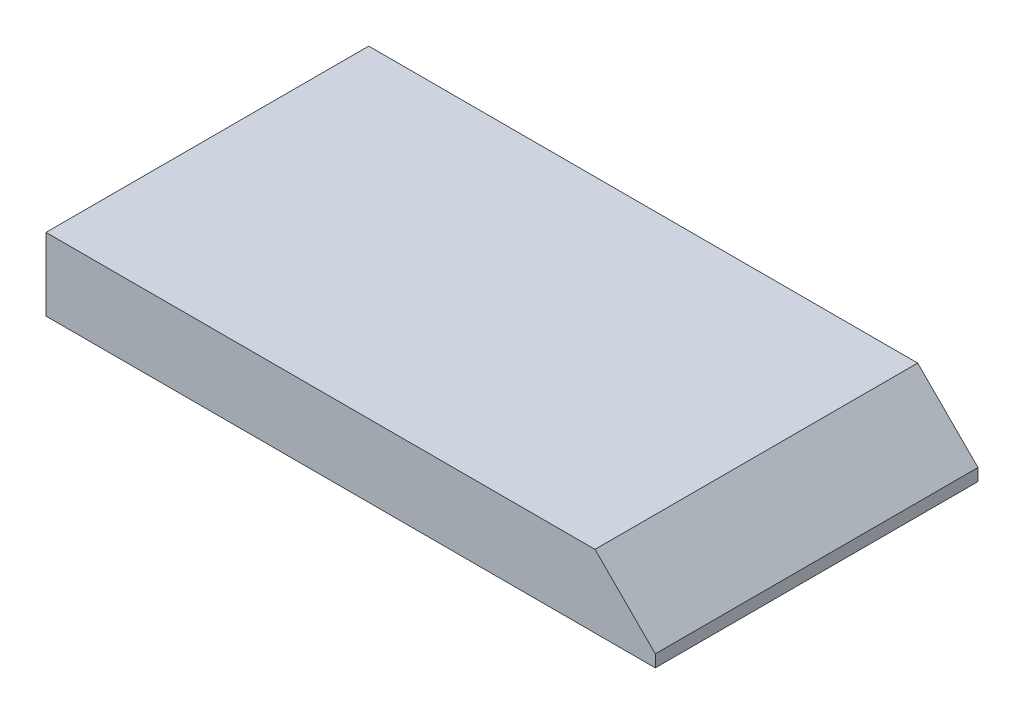
ISO-10303-21;
HEADER;
FILE_DESCRIPTION(('STEP AP214'),'2;1');
FILE_NAME('part.step','',(''),(''),'','','');
FILE_SCHEMA(('AUTOMOTIVE_DESIGN { 1 0 10303 214 1 1 1 1 }'));
ENDSEC;
DATA;
#1=APPLICATION_CONTEXT('core data for automotive mechanical design processes');
#2=APPLICATION_PROTOCOL_DEFINITION('international standard','automotive_design',2000,#1);
#3=PRODUCT_CONTEXT('',#1,'mechanical');
#4=PRODUCT('Part','Part','',(#3));
#5=PRODUCT_RELATED_PRODUCT_CATEGORY('part','',(#4));
#6=PRODUCT_DEFINITION_FORMATION('','',#4);
#7=PRODUCT_DEFINITION_CONTEXT('part definition',#1,'design');
#8=PRODUCT_DEFINITION('design','',#6,#7);
#9=PRODUCT_DEFINITION_SHAPE('','',#8);
#10=(LENGTH_UNIT() NAMED_UNIT(*) SI_UNIT(.MILLI.,.METRE.));
#11=(NAMED_UNIT(*) PLANE_ANGLE_UNIT() SI_UNIT($,.RADIAN.));
#12=(NAMED_UNIT(*) SI_UNIT($,.STERADIAN.) SOLID_ANGLE_UNIT());
#13=UNCERTAINTY_MEASURE_WITH_UNIT(LENGTH_MEASURE(1.E-05),#10,'distance_accuracy_value','');
#14=(GEOMETRIC_REPRESENTATION_CONTEXT(3) GLOBAL_UNCERTAINTY_ASSIGNED_CONTEXT((#13)) GLOBAL_UNIT_ASSIGNED_CONTEXT((#10,
#11,#12)) REPRESENTATION_CONTEXT('',''));
#15=CARTESIAN_POINT('',(0.,0.,0.));
#16=DIRECTION('',(0.,0.,1.));
#17=DIRECTION('',(1.,0.,0.));
#18=AXIS2_PLACEMENT_3D('',#15,#16,#17);
#19=CARTESIAN_POINT('',(0.,0.,52.96));
#20=DIRECTION('',(1.,0.,0.));
#21=DIRECTION('',(0.,1.,0.));
#22=AXIS2_PLACEMENT_3D('',#19,#20,#21);
#23=PLANE('',#22);
#24=DIRECTION('',(0.,-1.,0.));
#25=VECTOR('',#24,1.);
#26=CARTESIAN_POINT('',(0.,0.,0.));
#27=LINE('',#26,#25);
#28=CARTESIAN_POINT('',(0.,0.,0.));
#29=VERTEX_POINT('',#28);
#30=CARTESIAN_POINT('',(0.,-11.8994949366117,0.));
#31=VERTEX_POINT('',#30);
#32=EDGE_CURVE('E122',#29,#31,#27,.T.);
#33=ORIENTED_EDGE('',*,*,#32,.T.);
#34=DIRECTION('',(0.,0.,-1.));
#35=VECTOR('',#34,1.);
#36=CARTESIAN_POINT('',(0.,-11.8994949366117,52.96));
#37=LINE('',#36,#35);
#38=CARTESIAN_POINT('',(0.,-11.8994949366117,52.96));
#39=VERTEX_POINT('',#38);
#40=EDGE_CURVE('E11',#39,#31,#37,.T.);
#41=ORIENTED_EDGE('',*,*,#40,.F.);
#42=DIRECTION('',(0.,-1.,0.));
#43=VECTOR('',#42,1.);
#44=CARTESIAN_POINT('',(0.,0.,52.96));
#45=LINE('',#44,#43);
#46=CARTESIAN_POINT('',(0.,0.,52.96));
#47=VERTEX_POINT('',#46);
#48=EDGE_CURVE('E135',#47,#39,#45,.T.);
#49=ORIENTED_EDGE('',*,*,#48,.F.);
#50=DIRECTION('',(0.,0.,-1.));
#51=VECTOR('',#50,1.);
#52=CARTESIAN_POINT('',(0.,0.,52.96));
#53=LINE('',#52,#51);
#54=EDGE_CURVE('E118',#47,#29,#53,.T.);
#55=ORIENTED_EDGE('',*,*,#54,.T.);
#56=EDGE_LOOP('',(#33,#41,#49,#55));
#57=FACE_BOUND('',#56,.T.);
#58=ADVANCED_FACE('F43',(#57),#23,.F.);
#59=CARTESIAN_POINT('',(0.,-11.8994949366117,52.96));
#60=DIRECTION('',(0.,1.,0.));
#61=DIRECTION('',(0.,0.,1.));
#62=AXIS2_PLACEMENT_3D('',#59,#60,#61);
#63=PLANE('',#62);
#64=DIRECTION('',(1.,0.,0.));
#65=VECTOR('',#64,1.);
#66=CARTESIAN_POINT('',(0.,-11.8994949366117,0.));
#67=LINE('',#66,#65);
#68=CARTESIAN_POINT('',(100.,-11.8994949366117,0.));
#69=VERTEX_POINT('',#68);
#70=EDGE_CURVE('E126',#31,#69,#67,.T.);
#71=ORIENTED_EDGE('',*,*,#70,.T.);
#72=DIRECTION('',(0.,0.,-1.));
#73=VECTOR('',#72,1.);
#74=CARTESIAN_POINT('',(100.,-11.8994949366117,52.96));
#75=LINE('',#74,#73);
#76=CARTESIAN_POINT('',(100.,-11.8994949366117,52.96));
#77=VERTEX_POINT('',#76);
#78=EDGE_CURVE('E52',#77,#69,#75,.T.);
#79=ORIENTED_EDGE('',*,*,#78,.F.);
#80=DIRECTION('',(1.,0.,0.));
#81=VECTOR('',#80,1.);
#82=CARTESIAN_POINT('',(0.,-11.8994949366117,52.96));
#83=LINE('',#82,#81);
#84=EDGE_CURVE('E94',#39,#77,#83,.T.);
#85=ORIENTED_EDGE('',*,*,#84,.F.);
#86=ORIENTED_EDGE('',*,*,#40,.T.);
#87=EDGE_LOOP('',(#71,#79,#85,#86));
#88=FACE_BOUND('',#87,.T.);
#89=ADVANCED_FACE('F157',(#88),#63,.F.);
#90=CARTESIAN_POINT('',(100.,-9.89949493661172,52.96));
#91=DIRECTION('',(-1.,0.,0.));
#92=DIRECTION('',(0.,-1.,0.));
#93=AXIS2_PLACEMENT_3D('',#90,#91,#92);
#94=PLANE('',#93);
#95=DIRECTION('',(0.,1.,0.));
#96=VECTOR('',#95,1.);
#97=CARTESIAN_POINT('',(100.,-9.89949493661172,0.));
#98=LINE('',#97,#96);
#99=CARTESIAN_POINT('',(100.,-9.89949493661172,0.));
#100=VERTEX_POINT('',#99);
#101=EDGE_CURVE('E110',#69,#100,#98,.T.);
#102=ORIENTED_EDGE('',*,*,#101,.T.);
#103=DIRECTION('',(0.,0.,-1.));
#104=VECTOR('',#103,1.);
#105=CARTESIAN_POINT('',(100.,-9.89949493661172,52.96));
#106=LINE('',#105,#104);
#107=CARTESIAN_POINT('',(100.,-9.89949493661172,52.96));
#108=VERTEX_POINT('',#107);
#109=EDGE_CURVE('E107',#108,#100,#106,.T.);
#110=ORIENTED_EDGE('',*,*,#109,.F.);
#111=DIRECTION('',(0.,1.,0.));
#112=VECTOR('',#111,1.);
#113=CARTESIAN_POINT('',(100.,-9.89949493661172,52.96));
#114=LINE('',#113,#112);
#115=EDGE_CURVE('E98',#77,#108,#114,.T.);
#116=ORIENTED_EDGE('',*,*,#115,.F.);
#117=ORIENTED_EDGE('',*,*,#78,.T.);
#118=EDGE_LOOP('',(#102,#110,#116,#117));
#119=FACE_BOUND('',#118,.T.);
#120=ADVANCED_FACE('F108',(#119),#94,.F.);
#121=CARTESIAN_POINT('',(100.,-9.89949493661172,52.96));
#122=DIRECTION('',(-0.707106781186551,-0.707106781186544,0.));
#123=DIRECTION('',(0.707106781186544,-0.707106781186551,0.));
#124=AXIS2_PLACEMENT_3D('',#121,#122,#123);
#125=PLANE('',#124);
#126=DIRECTION('',(-0.707106781186544,0.707106781186551,0.));
#127=VECTOR('',#126,1.);
#128=CARTESIAN_POINT('',(100.,-9.89949493661172,0.));
#129=LINE('',#128,#127);
#130=CARTESIAN_POINT('',(90.1005050633884,0.,0.));
#131=VERTEX_POINT('',#130);
#132=EDGE_CURVE('E80',#100,#131,#129,.T.);
#133=ORIENTED_EDGE('',*,*,#132,.T.);
#134=DIRECTION('',(0.,0.,-1.));
#135=VECTOR('',#134,1.);
#136=CARTESIAN_POINT('',(90.1005050633884,0.,52.96));
#137=LINE('',#136,#135);
#138=CARTESIAN_POINT('',(90.1005050633884,0.,52.96));
#139=VERTEX_POINT('',#138);
#140=EDGE_CURVE('E112',#139,#131,#137,.T.);
#141=ORIENTED_EDGE('',*,*,#140,.F.);
#142=DIRECTION('',(-0.707106781186544,0.707106781186551,0.));
#143=VECTOR('',#142,1.);
#144=CARTESIAN_POINT('',(100.,-9.89949493661172,52.96));
#145=LINE('',#144,#143);
#146=EDGE_CURVE('E102',#108,#139,#145,.T.);
#147=ORIENTED_EDGE('',*,*,#146,.F.);
#148=ORIENTED_EDGE('',*,*,#109,.T.);
#149=EDGE_LOOP('',(#133,#141,#147,#148));
#150=FACE_BOUND('',#149,.T.);
#151=ADVANCED_FACE('F114',(#150),#125,.F.);
#152=CARTESIAN_POINT('',(0.,0.,52.96));
#153=DIRECTION('',(0.,-1.,0.));
#154=DIRECTION('',(0.,0.,-1.));
#155=AXIS2_PLACEMENT_3D('',#152,#153,#154);
#156=PLANE('',#155);
#157=DIRECTION('',(-1.,0.,0.));
#158=VECTOR('',#157,1.);
#159=CARTESIAN_POINT('',(0.,0.,0.));
#160=LINE('',#159,#158);
#161=EDGE_CURVE('E86',#131,#29,#160,.T.);
#162=ORIENTED_EDGE('',*,*,#161,.T.);
#163=ORIENTED_EDGE('',*,*,#54,.F.);
#164=DIRECTION('',(-1.,0.,0.));
#165=VECTOR('',#164,1.);
#166=CARTESIAN_POINT('',(0.,0.,52.96));
#167=LINE('',#166,#165);
#168=EDGE_CURVE('E60',#139,#47,#167,.T.);
#169=ORIENTED_EDGE('',*,*,#168,.F.);
#170=ORIENTED_EDGE('',*,*,#140,.T.);
#171=EDGE_LOOP('',(#162,#163,#169,#170));
#172=FACE_BOUND('',#171,.T.);
#173=ADVANCED_FACE('F146',(#172),#156,.F.);
#174=CARTESIAN_POINT('',(0.,0.,52.96));
#175=DIRECTION('',(0.,0.,1.));
#176=DIRECTION('',(1.,0.,0.));
#177=AXIS2_PLACEMENT_3D('',#174,#175,#176);
#178=PLANE('',#177);
#179=ORIENTED_EDGE('',*,*,#48,.T.);
#180=ORIENTED_EDGE('',*,*,#84,.T.);
#181=ORIENTED_EDGE('',*,*,#115,.T.);
#182=ORIENTED_EDGE('',*,*,#146,.T.);
#183=ORIENTED_EDGE('',*,*,#168,.T.);
#184=EDGE_LOOP('',(#179,#180,#181,#182,#183));
#185=FACE_BOUND('',#184,.T.);
#186=ADVANCED_FACE('F100',(#185),#178,.T.);
#187=CARTESIAN_POINT('',(0.,0.,0.));
#188=DIRECTION('',(0.,0.,1.));
#189=DIRECTION('',(1.,0.,0.));
#190=AXIS2_PLACEMENT_3D('',#187,#188,#189);
#191=PLANE('',#190);
#192=ORIENTED_EDGE('',*,*,#32,.F.);
#193=ORIENTED_EDGE('',*,*,#161,.F.);
#194=ORIENTED_EDGE('',*,*,#132,.F.);
#195=ORIENTED_EDGE('',*,*,#101,.F.);
#196=ORIENTED_EDGE('',*,*,#70,.F.);
#197=EDGE_LOOP('',(#192,#193,#194,#195,#196));
#198=FACE_BOUND('',#197,.T.);
#199=ADVANCED_FACE('F142',(#198),#191,.F.);
#200=CLOSED_SHELL('',(#58,#89,#120,#151,#173,#186,#199));
#201=MANIFOLD_SOLID_BREP('B2',#200);
#202=ADVANCED_BREP_SHAPE_REPRESENTATION('',(#18,#201),#14);
#203=SHAPE_DEFINITION_REPRESENTATION(#9,#202);
ENDSEC;
END-ISO-10303-21;
